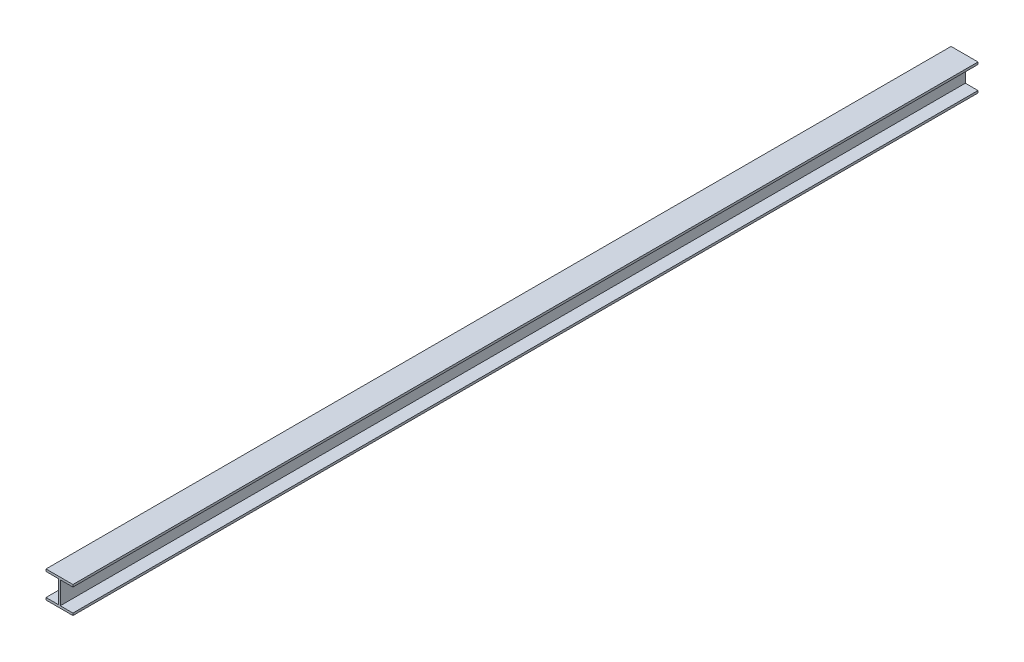
ISO-10303-21;
HEADER;
FILE_DESCRIPTION(('STEP AP214'),'2;1');
FILE_NAME('part.step','',(''),(''),'','','');
FILE_SCHEMA(('AUTOMOTIVE_DESIGN { 1 0 10303 214 1 1 1 1 }'));
ENDSEC;
DATA;
#1=APPLICATION_CONTEXT('core data for automotive mechanical design processes');
#2=APPLICATION_PROTOCOL_DEFINITION('international standard','automotive_design',2000,#1);
#3=PRODUCT_CONTEXT('',#1,'mechanical');
#4=PRODUCT('Part','Part','',(#3));
#5=PRODUCT_RELATED_PRODUCT_CATEGORY('part','',(#4));
#6=PRODUCT_DEFINITION_FORMATION('','',#4);
#7=PRODUCT_DEFINITION_CONTEXT('part definition',#1,'design');
#8=PRODUCT_DEFINITION('design','',#6,#7);
#9=PRODUCT_DEFINITION_SHAPE('','',#8);
#10=(LENGTH_UNIT() NAMED_UNIT(*) SI_UNIT(.MILLI.,.METRE.));
#11=(NAMED_UNIT(*) PLANE_ANGLE_UNIT() SI_UNIT($,.RADIAN.));
#12=(NAMED_UNIT(*) SI_UNIT($,.STERADIAN.) SOLID_ANGLE_UNIT());
#13=UNCERTAINTY_MEASURE_WITH_UNIT(LENGTH_MEASURE(1.E-05),#10,'distance_accuracy_value','');
#14=(GEOMETRIC_REPRESENTATION_CONTEXT(3) GLOBAL_UNCERTAINTY_ASSIGNED_CONTEXT((#13)) GLOBAL_UNIT_ASSIGNED_CONTEXT((#10,
#11,#12)) REPRESENTATION_CONTEXT('',''));
#15=CARTESIAN_POINT('',(0.,0.,0.));
#16=DIRECTION('',(0.,0.,1.));
#17=DIRECTION('',(1.,0.,0.));
#18=AXIS2_PLACEMENT_3D('',#15,#16,#17);
#19=CARTESIAN_POINT('',(0.,10.4648,4267.2));
#20=DIRECTION('',(1.,0.,0.));
#21=DIRECTION('',(0.,1.,0.));
#22=AXIS2_PLACEMENT_3D('',#19,#20,#21);
#23=PLANE('',#22);
#24=DIRECTION('',(0.,-1.,0.));
#25=VECTOR('',#24,1.);
#26=CARTESIAN_POINT('',(0.,10.4648,0.));
#27=LINE('',#26,#25);
#28=CARTESIAN_POINT('',(0.,10.4648,0.));
#29=VERTEX_POINT('',#28);
#30=CARTESIAN_POINT('',(0.,0.,0.));
#31=VERTEX_POINT('',#30);
#32=EDGE_CURVE('E153',#29,#31,#27,.T.);
#33=ORIENTED_EDGE('',*,*,#32,.T.);
#34=DIRECTION('',(0.,0.,-1.));
#35=VECTOR('',#34,1.);
#36=CARTESIAN_POINT('',(0.,0.,4267.2));
#37=LINE('',#36,#35);
#38=CARTESIAN_POINT('',(0.,0.,4267.2));
#39=VERTEX_POINT('',#38);
#40=EDGE_CURVE('E11',#39,#31,#37,.T.);
#41=ORIENTED_EDGE('',*,*,#40,.F.);
#42=DIRECTION('',(0.,-1.,0.));
#43=VECTOR('',#42,1.);
#44=CARTESIAN_POINT('',(0.,10.4648,4267.2));
#45=LINE('',#44,#43);
#46=CARTESIAN_POINT('',(0.,10.4648,4267.2));
#47=VERTEX_POINT('',#46);
#48=EDGE_CURVE('E175',#47,#39,#45,.T.);
#49=ORIENTED_EDGE('',*,*,#48,.F.);
#50=DIRECTION('',(0.,0.,-1.));
#51=VECTOR('',#50,1.);
#52=CARTESIAN_POINT('',(0.,10.4648,4267.2));
#53=LINE('',#52,#51);
#54=EDGE_CURVE('E149',#47,#29,#53,.T.);
#55=ORIENTED_EDGE('',*,*,#54,.T.);
#56=EDGE_LOOP('',(#33,#41,#49,#55));
#57=FACE_BOUND('',#56,.T.);
#58=ADVANCED_FACE('F33',(#57),#23,.F.);
#59=CARTESIAN_POINT('',(0.,0.,4267.2));
#60=DIRECTION('',(0.,1.,0.));
#61=DIRECTION('',(0.,0.,1.));
#62=AXIS2_PLACEMENT_3D('',#59,#60,#61);
#63=PLANE('',#62);
#64=DIRECTION('',(1.,0.,0.));
#65=VECTOR('',#64,1.);
#66=CARTESIAN_POINT('',(0.,0.,0.));
#67=LINE('',#66,#65);
#68=CARTESIAN_POINT('',(127.,0.,0.));
#69=VERTEX_POINT('',#68);
#70=EDGE_CURVE('E156',#31,#69,#67,.T.);
#71=ORIENTED_EDGE('',*,*,#70,.T.);
#72=DIRECTION('',(0.,0.,-1.));
#73=VECTOR('',#72,1.);
#74=CARTESIAN_POINT('',(127.,0.,4267.2));
#75=LINE('',#74,#73);
#76=CARTESIAN_POINT('',(127.,0.,4267.2));
#77=VERTEX_POINT('',#76);
#78=EDGE_CURVE('E41',#77,#69,#75,.T.);
#79=ORIENTED_EDGE('',*,*,#78,.F.);
#80=DIRECTION('',(1.,0.,0.));
#81=VECTOR('',#80,1.);
#82=CARTESIAN_POINT('',(0.,0.,4267.2));
#83=LINE('',#82,#81);
#84=EDGE_CURVE('E104',#39,#77,#83,.T.);
#85=ORIENTED_EDGE('',*,*,#84,.F.);
#86=ORIENTED_EDGE('',*,*,#40,.T.);
#87=EDGE_LOOP('',(#71,#79,#85,#86));
#88=FACE_BOUND('',#87,.T.);
#89=ADVANCED_FACE('F253',(#88),#63,.F.);
#90=CARTESIAN_POINT('',(127.,0.,4267.2));
#91=DIRECTION('',(-1.,0.,0.));
#92=DIRECTION('',(0.,0.,1.));
#93=AXIS2_PLACEMENT_3D('',#90,#91,#92);
#94=PLANE('',#93);
#95=DIRECTION('',(0.,1.,0.));
#96=VECTOR('',#95,1.);
#97=CARTESIAN_POINT('',(127.,0.,0.));
#98=LINE('',#97,#96);
#99=CARTESIAN_POINT('',(127.,10.4648,0.));
#100=VERTEX_POINT('',#99);
#101=EDGE_CURVE('E158',#69,#100,#98,.T.);
#102=ORIENTED_EDGE('',*,*,#101,.T.);
#103=DIRECTION('',(0.,0.,-1.));
#104=VECTOR('',#103,1.);
#105=CARTESIAN_POINT('',(127.,10.4648,4267.2));
#106=LINE('',#105,#104);
#107=CARTESIAN_POINT('',(127.,10.4648,4267.2));
#108=VERTEX_POINT('',#107);
#109=EDGE_CURVE('E194',#108,#100,#106,.T.);
#110=ORIENTED_EDGE('',*,*,#109,.F.);
#111=DIRECTION('',(0.,1.,0.));
#112=VECTOR('',#111,1.);
#113=CARTESIAN_POINT('',(127.,0.,4267.2));
#114=LINE('',#113,#112);
#115=EDGE_CURVE('E202',#77,#108,#114,.T.);
#116=ORIENTED_EDGE('',*,*,#115,.F.);
#117=ORIENTED_EDGE('',*,*,#78,.T.);
#118=EDGE_LOOP('',(#102,#110,#116,#117));
#119=FACE_BOUND('',#118,.T.);
#120=ADVANCED_FACE('F200',(#119),#94,.F.);
#121=CARTESIAN_POINT('',(127.,10.4648,4267.2));
#122=DIRECTION('',(0.,-1.,0.));
#123=DIRECTION('',(1.,0.,0.));
#124=AXIS2_PLACEMENT_3D('',#121,#122,#123);
#125=PLANE('',#124);
#126=DIRECTION('',(-1.,0.,0.));
#127=VECTOR('',#126,1.);
#128=CARTESIAN_POINT('',(127.,10.4648,0.));
#129=LINE('',#128,#127);
#130=CARTESIAN_POINT('',(67.4751,10.4648,0.));
#131=VERTEX_POINT('',#130);
#132=EDGE_CURVE('E160',#100,#131,#129,.T.);
#133=ORIENTED_EDGE('',*,*,#132,.T.);
#134=DIRECTION('',(0.,0.,-1.));
#135=VECTOR('',#134,1.);
#136=CARTESIAN_POINT('',(67.4751,10.4648,4267.2));
#137=LINE('',#136,#135);
#138=CARTESIAN_POINT('',(67.4751,10.4648,4267.2));
#139=VERTEX_POINT('',#138);
#140=EDGE_CURVE('E191',#139,#131,#137,.T.);
#141=ORIENTED_EDGE('',*,*,#140,.F.);
#142=DIRECTION('',(-1.,0.,0.));
#143=VECTOR('',#142,1.);
#144=CARTESIAN_POINT('',(127.,10.4648,4267.2));
#145=LINE('',#144,#143);
#146=EDGE_CURVE('E220',#108,#139,#145,.T.);
#147=ORIENTED_EDGE('',*,*,#146,.F.);
#148=ORIENTED_EDGE('',*,*,#109,.T.);
#149=EDGE_LOOP('',(#133,#141,#147,#148));
#150=FACE_BOUND('',#149,.T.);
#151=ADVANCED_FACE('F211',(#150),#125,.F.);
#152=CARTESIAN_POINT('',(67.4751,10.4648,4267.2));
#153=DIRECTION('',(-1.,0.,0.));
#154=DIRECTION('',(0.,0.,1.));
#155=AXIS2_PLACEMENT_3D('',#152,#153,#154);
#156=PLANE('',#155);
#157=DIRECTION('',(0.,1.,0.));
#158=VECTOR('',#157,1.);
#159=CARTESIAN_POINT('',(67.4751,10.4648,0.));
#160=LINE('',#159,#158);
#161=CARTESIAN_POINT('',(67.4751,116.5352,0.));
#162=VERTEX_POINT('',#161);
#163=EDGE_CURVE('E162',#131,#162,#160,.T.);
#164=ORIENTED_EDGE('',*,*,#163,.T.);
#165=DIRECTION('',(0.,0.,-1.));
#166=VECTOR('',#165,1.);
#167=CARTESIAN_POINT('',(67.4751,116.5352,4267.2));
#168=LINE('',#167,#166);
#169=CARTESIAN_POINT('',(67.4751,116.5352,4267.2));
#170=VERTEX_POINT('',#169);
#171=EDGE_CURVE('E188',#170,#162,#168,.T.);
#172=ORIENTED_EDGE('',*,*,#171,.F.);
#173=DIRECTION('',(0.,1.,0.));
#174=VECTOR('',#173,1.);
#175=CARTESIAN_POINT('',(67.4751,10.4648,4267.2));
#176=LINE('',#175,#174);
#177=EDGE_CURVE('E217',#139,#170,#176,.T.);
#178=ORIENTED_EDGE('',*,*,#177,.F.);
#179=ORIENTED_EDGE('',*,*,#140,.T.);
#180=EDGE_LOOP('',(#164,#172,#178,#179));
#181=FACE_BOUND('',#180,.T.);
#182=ADVANCED_FACE('F215',(#181),#156,.F.);
#183=CARTESIAN_POINT('',(67.4751,116.5352,4267.2));
#184=DIRECTION('',(0.,1.,0.));
#185=DIRECTION('',(-1.,0.,0.));
#186=AXIS2_PLACEMENT_3D('',#183,#184,#185);
#187=PLANE('',#186);
#188=DIRECTION('',(1.,0.,0.));
#189=VECTOR('',#188,1.);
#190=CARTESIAN_POINT('',(67.4751,116.5352,0.));
#191=LINE('',#190,#189);
#192=CARTESIAN_POINT('',(127.,116.5352,0.));
#193=VERTEX_POINT('',#192);
#194=EDGE_CURVE('E164',#162,#193,#191,.T.);
#195=ORIENTED_EDGE('',*,*,#194,.T.);
#196=DIRECTION('',(0.,0.,-1.));
#197=VECTOR('',#196,1.);
#198=CARTESIAN_POINT('',(127.,116.5352,4267.2));
#199=LINE('',#198,#197);
#200=CARTESIAN_POINT('',(127.,116.5352,4267.2));
#201=VERTEX_POINT('',#200);
#202=EDGE_CURVE('E185',#201,#193,#199,.T.);
#203=ORIENTED_EDGE('',*,*,#202,.F.);
#204=DIRECTION('',(1.,0.,0.));
#205=VECTOR('',#204,1.);
#206=CARTESIAN_POINT('',(67.4751,116.5352,4267.2));
#207=LINE('',#206,#205);
#208=EDGE_CURVE('E219',#170,#201,#207,.T.);
#209=ORIENTED_EDGE('',*,*,#208,.F.);
#210=ORIENTED_EDGE('',*,*,#171,.T.);
#211=EDGE_LOOP('',(#195,#203,#209,#210));
#212=FACE_BOUND('',#211,.T.);
#213=ADVANCED_FACE('F266',(#212),#187,.F.);
#214=CARTESIAN_POINT('',(127.,116.5352,4267.2));
#215=DIRECTION('',(-1.,0.,0.));
#216=DIRECTION('',(0.,0.,1.));
#217=AXIS2_PLACEMENT_3D('',#214,#215,#216);
#218=PLANE('',#217);
#219=DIRECTION('',(0.,1.,0.));
#220=VECTOR('',#219,1.);
#221=CARTESIAN_POINT('',(127.,116.5352,0.));
#222=LINE('',#221,#220);
#223=CARTESIAN_POINT('',(127.,127.,0.));
#224=VERTEX_POINT('',#223);
#225=EDGE_CURVE('E166',#193,#224,#222,.T.);
#226=ORIENTED_EDGE('',*,*,#225,.T.);
#227=DIRECTION('',(0.,0.,-1.));
#228=VECTOR('',#227,1.);
#229=CARTESIAN_POINT('',(127.,127.,4267.2));
#230=LINE('',#229,#228);
#231=CARTESIAN_POINT('',(127.,127.,4267.2));
#232=VERTEX_POINT('',#231);
#233=EDGE_CURVE('E182',#232,#224,#230,.T.);
#234=ORIENTED_EDGE('',*,*,#233,.F.);
#235=DIRECTION('',(0.,1.,0.));
#236=VECTOR('',#235,1.);
#237=CARTESIAN_POINT('',(127.,116.5352,4267.2));
#238=LINE('',#237,#236);
#239=EDGE_CURVE('E222',#201,#232,#238,.T.);
#240=ORIENTED_EDGE('',*,*,#239,.F.);
#241=ORIENTED_EDGE('',*,*,#202,.T.);
#242=EDGE_LOOP('',(#226,#234,#240,#241));
#243=FACE_BOUND('',#242,.T.);
#244=ADVANCED_FACE('F269',(#243),#218,.F.);
#245=CARTESIAN_POINT('',(127.,127.,4267.2));
#246=DIRECTION('',(0.,-1.,0.));
#247=DIRECTION('',(1.,0.,0.));
#248=AXIS2_PLACEMENT_3D('',#245,#246,#247);
#249=PLANE('',#248);
#250=DIRECTION('',(-1.,0.,0.));
#251=VECTOR('',#250,1.);
#252=CARTESIAN_POINT('',(127.,127.,0.));
#253=LINE('',#252,#251);
#254=CARTESIAN_POINT('',(0.,127.,0.));
#255=VERTEX_POINT('',#254);
#256=EDGE_CURVE('E168',#224,#255,#253,.T.);
#257=ORIENTED_EDGE('',*,*,#256,.T.);
#258=DIRECTION('',(0.,0.,-1.));
#259=VECTOR('',#258,1.);
#260=CARTESIAN_POINT('',(0.,127.,4267.2));
#261=LINE('',#260,#259);
#262=CARTESIAN_POINT('',(0.,127.,4267.2));
#263=VERTEX_POINT('',#262);
#264=EDGE_CURVE('E179',#263,#255,#261,.T.);
#265=ORIENTED_EDGE('',*,*,#264,.F.);
#266=DIRECTION('',(-1.,0.,0.));
#267=VECTOR('',#266,1.);
#268=CARTESIAN_POINT('',(127.,127.,4267.2));
#269=LINE('',#268,#267);
#270=EDGE_CURVE('E228',#232,#263,#269,.T.);
#271=ORIENTED_EDGE('',*,*,#270,.F.);
#272=ORIENTED_EDGE('',*,*,#233,.T.);
#273=EDGE_LOOP('',(#257,#265,#271,#272));
#274=FACE_BOUND('',#273,.T.);
#275=ADVANCED_FACE('F234',(#274),#249,.F.);
#276=CARTESIAN_POINT('',(0.,127.,4267.2));
#277=DIRECTION('',(1.,0.,0.));
#278=DIRECTION('',(0.,1.,0.));
#279=AXIS2_PLACEMENT_3D('',#276,#277,#278);
#280=PLANE('',#279);
#281=DIRECTION('',(0.,-1.,0.));
#282=VECTOR('',#281,1.);
#283=CARTESIAN_POINT('',(0.,127.,0.));
#284=LINE('',#283,#282);
#285=CARTESIAN_POINT('',(0.,116.5352,0.));
#286=VERTEX_POINT('',#285);
#287=EDGE_CURVE('E170',#255,#286,#284,.T.);
#288=ORIENTED_EDGE('',*,*,#287,.T.);
#289=DIRECTION('',(0.,0.,-1.));
#290=VECTOR('',#289,1.);
#291=CARTESIAN_POINT('',(0.,116.5352,4267.2));
#292=LINE('',#291,#290);
#293=CARTESIAN_POINT('',(0.,116.5352,4267.2));
#294=VERTEX_POINT('',#293);
#295=EDGE_CURVE('E144',#294,#286,#292,.T.);
#296=ORIENTED_EDGE('',*,*,#295,.F.);
#297=DIRECTION('',(0.,-1.,0.));
#298=VECTOR('',#297,1.);
#299=CARTESIAN_POINT('',(0.,127.,4267.2));
#300=LINE('',#299,#298);
#301=EDGE_CURVE('E135',#263,#294,#300,.T.);
#302=ORIENTED_EDGE('',*,*,#301,.F.);
#303=ORIENTED_EDGE('',*,*,#264,.T.);
#304=EDGE_LOOP('',(#288,#296,#302,#303));
#305=FACE_BOUND('',#304,.T.);
#306=ADVANCED_FACE('F238',(#305),#280,.F.);
#307=CARTESIAN_POINT('',(0.,116.5352,4267.2));
#308=DIRECTION('',(0.,1.,0.));
#309=DIRECTION('',(0.,0.,1.));
#310=AXIS2_PLACEMENT_3D('',#307,#308,#309);
#311=PLANE('',#310);
#312=DIRECTION('',(1.,0.,0.));
#313=VECTOR('',#312,1.);
#314=CARTESIAN_POINT('',(0.,116.5352,0.));
#315=LINE('',#314,#313);
#316=CARTESIAN_POINT('',(59.5249,116.5352,0.));
#317=VERTEX_POINT('',#316);
#318=EDGE_CURVE('E143',#286,#317,#315,.T.);
#319=ORIENTED_EDGE('',*,*,#318,.T.);
#320=DIRECTION('',(0.,0.,-1.));
#321=VECTOR('',#320,1.);
#322=CARTESIAN_POINT('',(59.5249,116.5352,4267.2));
#323=LINE('',#322,#321);
#324=CARTESIAN_POINT('',(59.5249,116.5352,4267.2));
#325=VERTEX_POINT('',#324);
#326=EDGE_CURVE('E140',#325,#317,#323,.T.);
#327=ORIENTED_EDGE('',*,*,#326,.F.);
#328=DIRECTION('',(1.,0.,0.));
#329=VECTOR('',#328,1.);
#330=CARTESIAN_POINT('',(0.,116.5352,4267.2));
#331=LINE('',#330,#329);
#332=EDGE_CURVE('E129',#294,#325,#331,.T.);
#333=ORIENTED_EDGE('',*,*,#332,.F.);
#334=ORIENTED_EDGE('',*,*,#295,.T.);
#335=EDGE_LOOP('',(#319,#327,#333,#334));
#336=FACE_BOUND('',#335,.T.);
#337=ADVANCED_FACE('F141',(#336),#311,.F.);
#338=CARTESIAN_POINT('',(59.5249,116.5352,4267.2));
#339=DIRECTION('',(1.,0.,0.));
#340=DIRECTION('',(0.,1.,0.));
#341=AXIS2_PLACEMENT_3D('',#338,#339,#340);
#342=PLANE('',#341);
#343=DIRECTION('',(0.,-1.,0.));
#344=VECTOR('',#343,1.);
#345=CARTESIAN_POINT('',(59.5249,116.5352,0.));
#346=LINE('',#345,#344);
#347=CARTESIAN_POINT('',(59.5249,10.4648,0.));
#348=VERTEX_POINT('',#347);
#349=EDGE_CURVE('E90',#317,#348,#346,.T.);
#350=ORIENTED_EDGE('',*,*,#349,.T.);
#351=DIRECTION('',(0.,0.,-1.));
#352=VECTOR('',#351,1.);
#353=CARTESIAN_POINT('',(59.5249,10.4648,4267.2));
#354=LINE('',#353,#352);
#355=CARTESIAN_POINT('',(59.5249,10.4648,4267.2));
#356=VERTEX_POINT('',#355);
#357=EDGE_CURVE('E145',#356,#348,#354,.T.);
#358=ORIENTED_EDGE('',*,*,#357,.F.);
#359=DIRECTION('',(0.,-1.,0.));
#360=VECTOR('',#359,1.);
#361=CARTESIAN_POINT('',(59.5249,116.5352,4267.2));
#362=LINE('',#361,#360);
#363=EDGE_CURVE('E133',#325,#356,#362,.T.);
#364=ORIENTED_EDGE('',*,*,#363,.F.);
#365=ORIENTED_EDGE('',*,*,#326,.T.);
#366=EDGE_LOOP('',(#350,#358,#364,#365));
#367=FACE_BOUND('',#366,.T.);
#368=ADVANCED_FACE('F147',(#367),#342,.F.);
#369=CARTESIAN_POINT('',(59.5249,10.4648,4267.2));
#370=DIRECTION('',(0.,-1.,0.));
#371=DIRECTION('',(1.,0.,0.));
#372=AXIS2_PLACEMENT_3D('',#369,#370,#371);
#373=PLANE('',#372);
#374=DIRECTION('',(-1.,0.,0.));
#375=VECTOR('',#374,1.);
#376=CARTESIAN_POINT('',(59.5249,10.4648,0.));
#377=LINE('',#376,#375);
#378=EDGE_CURVE('E96',#348,#29,#377,.T.);
#379=ORIENTED_EDGE('',*,*,#378,.T.);
#380=ORIENTED_EDGE('',*,*,#54,.F.);
#381=DIRECTION('',(-1.,0.,0.));
#382=VECTOR('',#381,1.);
#383=CARTESIAN_POINT('',(59.5249,10.4648,4267.2));
#384=LINE('',#383,#382);
#385=EDGE_CURVE('E49',#356,#47,#384,.T.);
#386=ORIENTED_EDGE('',*,*,#385,.F.);
#387=ORIENTED_EDGE('',*,*,#357,.T.);
#388=EDGE_LOOP('',(#379,#380,#386,#387));
#389=FACE_BOUND('',#388,.T.);
#390=ADVANCED_FACE('F242',(#389),#373,.F.);
#391=CARTESIAN_POINT('',(0.,0.,4267.2));
#392=DIRECTION('',(0.,0.,1.));
#393=DIRECTION('',(1.,0.,0.));
#394=AXIS2_PLACEMENT_3D('',#391,#392,#393);
#395=PLANE('',#394);
#396=ORIENTED_EDGE('',*,*,#48,.T.);
#397=ORIENTED_EDGE('',*,*,#84,.T.);
#398=ORIENTED_EDGE('',*,*,#115,.T.);
#399=ORIENTED_EDGE('',*,*,#146,.T.);
#400=ORIENTED_EDGE('',*,*,#177,.T.);
#401=ORIENTED_EDGE('',*,*,#208,.T.);
#402=ORIENTED_EDGE('',*,*,#239,.T.);
#403=ORIENTED_EDGE('',*,*,#270,.T.);
#404=ORIENTED_EDGE('',*,*,#301,.T.);
#405=ORIENTED_EDGE('',*,*,#332,.T.);
#406=ORIENTED_EDGE('',*,*,#363,.T.);
#407=ORIENTED_EDGE('',*,*,#385,.T.);
#408=EDGE_LOOP('',(#396,#397,#398,#399,#400,#401,#402,#403,#404,#405,#406,#407));
#409=FACE_BOUND('',#408,.T.);
#410=ADVANCED_FACE('F131',(#409),#395,.T.);
#411=CARTESIAN_POINT('',(0.,0.,0.));
#412=DIRECTION('',(0.,0.,1.));
#413=DIRECTION('',(1.,0.,0.));
#414=AXIS2_PLACEMENT_3D('',#411,#412,#413);
#415=PLANE('',#414);
#416=ORIENTED_EDGE('',*,*,#32,.F.);
#417=ORIENTED_EDGE('',*,*,#378,.F.);
#418=ORIENTED_EDGE('',*,*,#349,.F.);
#419=ORIENTED_EDGE('',*,*,#318,.F.);
#420=ORIENTED_EDGE('',*,*,#287,.F.);
#421=ORIENTED_EDGE('',*,*,#256,.F.);
#422=ORIENTED_EDGE('',*,*,#225,.F.);
#423=ORIENTED_EDGE('',*,*,#194,.F.);
#424=ORIENTED_EDGE('',*,*,#163,.F.);
#425=ORIENTED_EDGE('',*,*,#132,.F.);
#426=ORIENTED_EDGE('',*,*,#101,.F.);
#427=ORIENTED_EDGE('',*,*,#70,.F.);
#428=EDGE_LOOP('',(#416,#417,#418,#419,#420,#421,#422,#423,#424,#425,#426,#427));
#429=FACE_BOUND('',#428,.T.);
#430=ADVANCED_FACE('F206',(#429),#415,.F.);
#431=CLOSED_SHELL('',(#58,#89,#120,#151,#182,#213,#244,#275,#306,#337,#368,#390,#410,#430));
#432=MANIFOLD_SOLID_BREP('B2',#431);
#433=ADVANCED_BREP_SHAPE_REPRESENTATION('',(#18,#432),#14);
#434=SHAPE_DEFINITION_REPRESENTATION(#9,#433);
ENDSEC;
END-ISO-10303-21;
